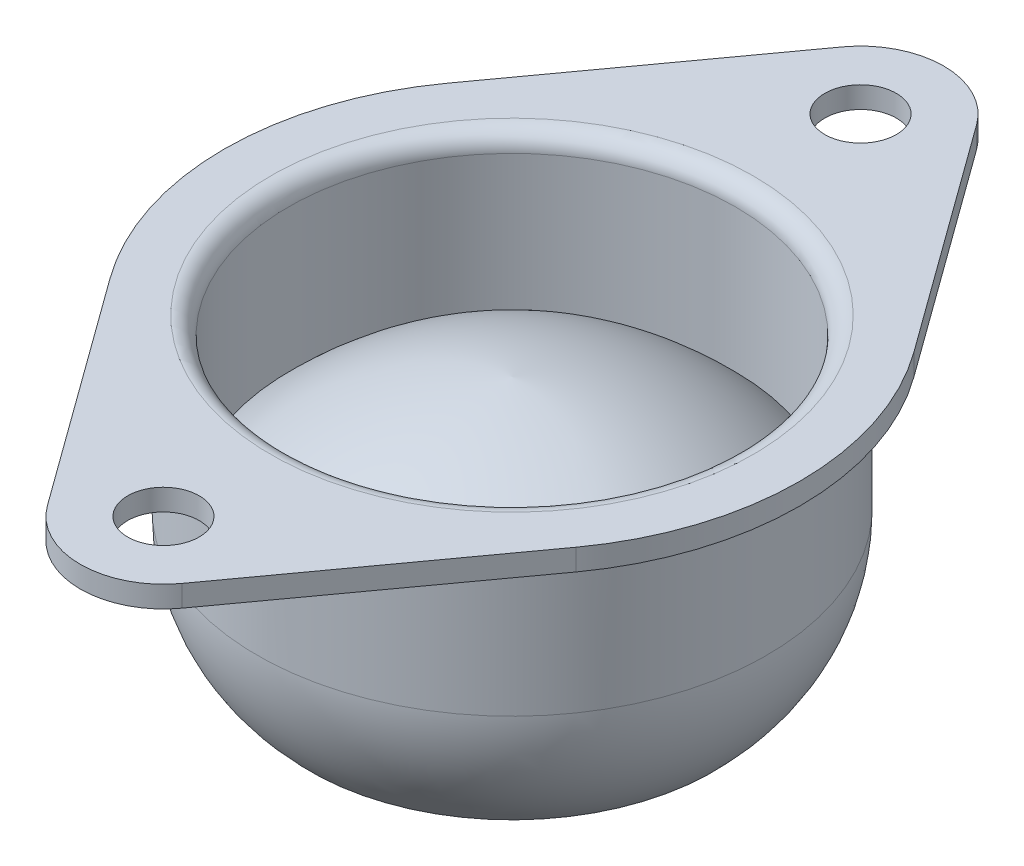
ISO-10303-21;
HEADER;
FILE_DESCRIPTION(('STEP AP214'),'2;1');
FILE_NAME('part.step','',(''),(''),'','','');
FILE_SCHEMA(('AUTOMOTIVE_DESIGN { 1 0 10303 214 1 1 1 1 }'));
ENDSEC;
DATA;
#1=APPLICATION_CONTEXT('core data for automotive mechanical design processes');
#2=APPLICATION_PROTOCOL_DEFINITION('international standard','automotive_design',2000,#1);
#3=PRODUCT_CONTEXT('',#1,'mechanical');
#4=PRODUCT('Part','Part','',(#3));
#5=PRODUCT_RELATED_PRODUCT_CATEGORY('part','',(#4));
#6=PRODUCT_DEFINITION_FORMATION('','',#4);
#7=PRODUCT_DEFINITION_CONTEXT('part definition',#1,'design');
#8=PRODUCT_DEFINITION('design','',#6,#7);
#9=PRODUCT_DEFINITION_SHAPE('','',#8);
#10=(LENGTH_UNIT() NAMED_UNIT(*) SI_UNIT(.MILLI.,.METRE.));
#11=(NAMED_UNIT(*) PLANE_ANGLE_UNIT() SI_UNIT($,.RADIAN.));
#12=(NAMED_UNIT(*) SI_UNIT($,.STERADIAN.) SOLID_ANGLE_UNIT());
#13=UNCERTAINTY_MEASURE_WITH_UNIT(LENGTH_MEASURE(1.E-05),#10,'distance_accuracy_value','');
#14=(GEOMETRIC_REPRESENTATION_CONTEXT(3) GLOBAL_UNCERTAINTY_ASSIGNED_CONTEXT((#13)) GLOBAL_UNIT_ASSIGNED_CONTEXT((#10,
#11,#12)) REPRESENTATION_CONTEXT('',''));
#15=CARTESIAN_POINT('',(0.,0.,0.));
#16=DIRECTION('',(0.,0.,1.));
#17=DIRECTION('',(1.,0.,0.));
#18=AXIS2_PLACEMENT_3D('',#15,#16,#17);
#19=CARTESIAN_POINT('',(0.,-4.21271556201627,0.));
#20=DIRECTION('',(0.,-1.,0.));
#21=DIRECTION('',(0.,0.,-1.));
#22=AXIS2_PLACEMENT_3D('',#19,#20,#21);
#23=CYLINDRICAL_SURFACE('',#22,9.2);
#24=CARTESIAN_POINT('',(0.,-4.21271556201627,0.));
#25=DIRECTION('',(0.,-1.,0.));
#26=DIRECTION('',(0.,0.,-1.));
#27=AXIS2_PLACEMENT_3D('',#24,#25,#26);
#28=CIRCLE('',#27,9.2);
#29=CARTESIAN_POINT('',(-7.44700221203728,-4.21271556201627,5.40205128205128));
#30=VERTEX_POINT('',#29);
#31=CARTESIAN_POINT('',(-7.44700221203728,-4.21271556201627,-5.40205128205128));
#32=VERTEX_POINT('',#31);
#33=EDGE_CURVE('E219',#30,#32,#28,.T.);
#34=ORIENTED_EDGE('',*,*,#33,.T.);
#35=DIRECTION('',(0.,1.,0.));
#36=VECTOR('',#35,1.);
#37=CARTESIAN_POINT('',(-7.44700221203728,-38.0695015819993,-5.40205128205128));
#38=LINE('',#37,#36);
#39=CARTESIAN_POINT('',(-7.44700221203728,-4.89842984773056,-5.40205128205128));
#40=VERTEX_POINT('',#39);
#41=EDGE_CURVE('E191',#40,#32,#38,.T.);
#42=ORIENTED_EDGE('',*,*,#41,.F.);
#43=CARTESIAN_POINT('',(0.,-4.89842984773056,0.));
#44=DIRECTION('',(0.,-1.,0.));
#45=DIRECTION('',(0.,0.,-1.));
#46=AXIS2_PLACEMENT_3D('',#43,#44,#45);
#47=CIRCLE('',#46,9.2);
#48=CARTESIAN_POINT('',(-7.44700221203727,-4.89842984773056,5.40205128205128));
#49=VERTEX_POINT('',#48);
#50=EDGE_CURVE('E214',#49,#40,#47,.T.);
#51=ORIENTED_EDGE('',*,*,#50,.F.);
#52=DIRECTION('',(0.,1.,0.));
#53=VECTOR('',#52,1.);
#54=CARTESIAN_POINT('',(-7.44700221203728,-38.0695015819993,5.40205128205128));
#55=LINE('',#54,#53);
#56=EDGE_CURVE('E58',#49,#30,#55,.T.);
#57=ORIENTED_EDGE('',*,*,#56,.T.);
#58=EDGE_LOOP('',(#34,#42,#51,#57));
#59=FACE_BOUND('',#58,.T.);
#60=ADVANCED_FACE('F42',(#59),#23,.T.);
#61=CARTESIAN_POINT('',(0.,-4.21271556201627,0.));
#62=DIRECTION('',(0.,-1.,0.));
#63=DIRECTION('',(0.,0.,-1.));
#64=AXIS2_PLACEMENT_3D('',#61,#62,#63);
#65=PLANE('',#64);
#66=CARTESIAN_POINT('',(0.,-4.21271556201627,0.));
#67=DIRECTION('',(0.,-1.,0.));
#68=DIRECTION('',(0.,0.,-1.));
#69=AXIS2_PLACEMENT_3D('',#66,#67,#68);
#70=CIRCLE('',#69,7.71428571428572);
#71=CARTESIAN_POINT('',(0.,-4.21271556201627,-7.71428571428572));
#72=VERTEX_POINT('',#71);
#73=EDGE_CURVE('E228',#72,#72,#70,.T.);
#74=ORIENTED_EDGE('',*,*,#73,.T.);
#75=EDGE_LOOP('',(#74));
#76=FACE_BOUND('',#75,.T.);
#77=CARTESIAN_POINT('',(7.44700221203728,-4.21271556201627,-5.40205128205128));
#78=VERTEX_POINT('',#77);
#79=CARTESIAN_POINT('',(7.44700221203728,-4.21271556201627,5.40205128205128));
#80=VERTEX_POINT('',#79);
#81=EDGE_CURVE('E220',#78,#80,#28,.T.);
#82=ORIENTED_EDGE('',*,*,#81,.F.);
#83=DIRECTION('',(0.587179487179487,0.,0.809456762177965));
#84=VECTOR('',#83,1.);
#85=CARTESIAN_POINT('',(7.44700221203727,-4.21271556201627,-5.40205128205128));
#86=LINE('',#85,#84);
#87=CARTESIAN_POINT('',(2.15084225378716,-4.21271556201627,-12.7030769230769));
#88=VERTEX_POINT('',#87);
#89=EDGE_CURVE('E126',#88,#78,#86,.T.);
#90=ORIENTED_EDGE('',*,*,#89,.F.);
#91=CARTESIAN_POINT('',(0.,-4.21271556201627,-11.1428571428571));
#92=DIRECTION('',(0.,1.,0.));
#93=DIRECTION('',(0.,0.,1.));
#94=AXIS2_PLACEMENT_3D('',#91,#92,#93);
#95=CIRCLE('',#94,2.65714285714286);
#96=CARTESIAN_POINT('',(-2.15084225378716,-4.21271556201627,-12.7030769230769));
#97=VERTEX_POINT('',#96);
#98=EDGE_CURVE('E154',#88,#97,#95,.T.);
#99=ORIENTED_EDGE('',*,*,#98,.T.);
#100=DIRECTION('',(-0.587179487179487,0.,0.809456762177965));
#101=VECTOR('',#100,1.);
#102=CARTESIAN_POINT('',(-7.44700221203728,-4.21271556201627,-5.40205128205128));
#103=LINE('',#102,#101);
#104=EDGE_CURVE('E158',#97,#32,#103,.T.);
#105=ORIENTED_EDGE('',*,*,#104,.T.);
#106=ORIENTED_EDGE('',*,*,#33,.F.);
#107=DIRECTION('',(-0.587179487179487,0.,-0.809456762177965));
#108=VECTOR('',#107,1.);
#109=CARTESIAN_POINT('',(-7.44700221203728,-4.21271556201627,5.40205128205128));
#110=LINE('',#109,#108);
#111=CARTESIAN_POINT('',(-2.15084225378716,-4.21271556201627,12.7030769230769));
#112=VERTEX_POINT('',#111);
#113=EDGE_CURVE('E162',#112,#30,#110,.T.);
#114=ORIENTED_EDGE('',*,*,#113,.F.);
#115=CARTESIAN_POINT('',(0.,-4.21271556201627,11.1428571428571));
#116=DIRECTION('',(0.,1.,0.));
#117=DIRECTION('',(0.,0.,1.));
#118=AXIS2_PLACEMENT_3D('',#115,#116,#117);
#119=CIRCLE('',#118,2.65714285714286);
#120=CARTESIAN_POINT('',(2.15084225378716,-4.21271556201627,12.7030769230769));
#121=VERTEX_POINT('',#120);
#122=EDGE_CURVE('E165',#112,#121,#119,.T.);
#123=ORIENTED_EDGE('',*,*,#122,.T.);
#124=DIRECTION('',(0.587179487179487,0.,-0.809456762177965));
#125=VECTOR('',#124,1.);
#126=CARTESIAN_POINT('',(7.44700221203727,-4.21271556201627,5.40205128205128));
#127=LINE('',#126,#125);
#128=EDGE_CURVE('E169',#121,#80,#127,.T.);
#129=ORIENTED_EDGE('',*,*,#128,.T.);
#130=EDGE_LOOP('',(#82,#90,#99,#105,#106,#114,#123,#129));
#131=FACE_BOUND('',#130,.T.);
#132=CARTESIAN_POINT('',(0.,-4.21271556201627,11.1428571428571));
#133=DIRECTION('',(0.,1.,0.));
#134=DIRECTION('',(0.,0.,1.));
#135=AXIS2_PLACEMENT_3D('',#132,#133,#134);
#136=CIRCLE('',#135,1.14285714285714);
#137=CARTESIAN_POINT('',(0.,-4.21271556201627,12.2857142857143));
#138=VERTEX_POINT('',#137);
#139=EDGE_CURVE('E173',#138,#138,#136,.T.);
#140=ORIENTED_EDGE('',*,*,#139,.F.);
#141=EDGE_LOOP('',(#140));
#142=FACE_BOUND('',#141,.T.);
#143=CARTESIAN_POINT('',(0.,-4.21271556201627,-11.1428571428571));
#144=DIRECTION('',(0.,1.,0.));
#145=DIRECTION('',(0.,0.,1.));
#146=AXIS2_PLACEMENT_3D('',#143,#144,#145);
#147=CIRCLE('',#146,1.14285714285714);
#148=CARTESIAN_POINT('',(0.,-4.21271556201627,-10.));
#149=VERTEX_POINT('',#148);
#150=EDGE_CURVE('E122',#149,#149,#147,.T.);
#151=ORIENTED_EDGE('',*,*,#150,.F.);
#152=EDGE_LOOP('',(#151));
#153=FACE_BOUND('',#152,.T.);
#154=ADVANCED_FACE('F247',(#76,#131,#142,#153),#65,.F.);
#155=ORIENTED_EDGE('',*,*,#81,.T.);
#156=DIRECTION('',(0.,1.,0.));
#157=VECTOR('',#156,1.);
#158=CARTESIAN_POINT('',(7.44700221203728,-38.0695015819993,5.40205128205128));
#159=LINE('',#158,#157);
#160=CARTESIAN_POINT('',(7.44700221203727,-4.89842984773056,5.40205128205128));
#161=VERTEX_POINT('',#160);
#162=EDGE_CURVE('E180',#161,#80,#159,.T.);
#163=ORIENTED_EDGE('',*,*,#162,.F.);
#164=CARTESIAN_POINT('',(7.44700221203727,-4.89842984773056,-5.40205128205128));
#165=VERTEX_POINT('',#164);
#166=EDGE_CURVE('E215',#165,#161,#47,.T.);
#167=ORIENTED_EDGE('',*,*,#166,.F.);
#168=DIRECTION('',(0.,1.,0.));
#169=VECTOR('',#168,1.);
#170=CARTESIAN_POINT('',(7.44700221203728,-38.0695015819993,-5.40205128205128));
#171=LINE('',#170,#169);
#172=EDGE_CURVE('E66',#165,#78,#171,.T.);
#173=ORIENTED_EDGE('',*,*,#172,.T.);
#174=EDGE_LOOP('',(#155,#163,#167,#173));
#175=FACE_BOUND('',#174,.T.);
#176=ADVANCED_FACE('F250',(#175),#23,.T.);
#177=CARTESIAN_POINT('',(-9.2,-4.89842984773056,0.));
#178=DIRECTION('',(0.,1.,0.));
#179=DIRECTION('',(0.,0.,1.));
#180=AXIS2_PLACEMENT_3D('',#177,#178,#179);
#181=PLANE('',#180);
#182=CARTESIAN_POINT('',(0.,-4.89842984773056,0.));
#183=DIRECTION('',(0.,1.,0.));
#184=DIRECTION('',(0.,0.,1.));
#185=AXIS2_PLACEMENT_3D('',#182,#183,#184);
#186=CIRCLE('',#185,8.71428571428571);
#187=CARTESIAN_POINT('',(0.,-4.89842984773056,8.71428571428571));
#188=VERTEX_POINT('',#187);
#189=EDGE_CURVE('E11',#188,#188,#186,.T.);
#190=ORIENTED_EDGE('',*,*,#189,.T.);
#191=EDGE_LOOP('',(#190));
#192=FACE_BOUND('',#191,.T.);
#193=ORIENTED_EDGE('',*,*,#166,.T.);
#194=DIRECTION('',(-0.587179487179487,0.,0.809456762177965));
#195=VECTOR('',#194,1.);
#196=CARTESIAN_POINT('',(7.44700221203727,-4.89842984773056,5.40205128205128));
#197=LINE('',#196,#195);
#198=CARTESIAN_POINT('',(2.15084225378716,-4.89842984773056,12.7030769230769));
#199=VERTEX_POINT('',#198);
#200=EDGE_CURVE('E147',#161,#199,#197,.T.);
#201=ORIENTED_EDGE('',*,*,#200,.T.);
#202=CARTESIAN_POINT('',(0.,-4.89842984773056,11.1428571428571));
#203=DIRECTION('',(0.,1.,0.));
#204=DIRECTION('',(0.,0.,1.));
#205=AXIS2_PLACEMENT_3D('',#202,#203,#204);
#206=CIRCLE('',#205,2.65714285714286);
#207=CARTESIAN_POINT('',(-2.15084225378716,-4.89842984773056,12.7030769230769));
#208=VERTEX_POINT('',#207);
#209=EDGE_CURVE('E144',#199,#208,#206,.F.);
#210=ORIENTED_EDGE('',*,*,#209,.T.);
#211=DIRECTION('',(0.587179487179487,0.,0.809456762177965));
#212=VECTOR('',#211,1.);
#213=CARTESIAN_POINT('',(-7.44700221203728,-4.89842984773056,5.40205128205128));
#214=LINE('',#213,#212);
#215=EDGE_CURVE('E141',#49,#208,#214,.T.);
#216=ORIENTED_EDGE('',*,*,#215,.F.);
#217=ORIENTED_EDGE('',*,*,#50,.T.);
#218=DIRECTION('',(0.587179487179487,0.,-0.809456762177965));
#219=VECTOR('',#218,1.);
#220=CARTESIAN_POINT('',(-7.44700221203728,-4.89842984773056,-5.40205128205128));
#221=LINE('',#220,#219);
#222=CARTESIAN_POINT('',(-2.15084225378716,-4.89842984773056,-12.7030769230769));
#223=VERTEX_POINT('',#222);
#224=EDGE_CURVE('E138',#40,#223,#221,.T.);
#225=ORIENTED_EDGE('',*,*,#224,.T.);
#226=CARTESIAN_POINT('',(0.,-4.89842984773056,-11.1428571428571));
#227=DIRECTION('',(0.,1.,0.));
#228=DIRECTION('',(0.,0.,1.));
#229=AXIS2_PLACEMENT_3D('',#226,#227,#228);
#230=CIRCLE('',#229,2.65714285714286);
#231=CARTESIAN_POINT('',(2.15084225378716,-4.89842984773056,-12.7030769230769));
#232=VERTEX_POINT('',#231);
#233=EDGE_CURVE('E134',#223,#232,#230,.F.);
#234=ORIENTED_EDGE('',*,*,#233,.T.);
#235=DIRECTION('',(-0.587179487179487,0.,-0.809456762177965));
#236=VECTOR('',#235,1.);
#237=CARTESIAN_POINT('',(7.44700221203727,-4.89842984773056,-5.40205128205128));
#238=LINE('',#237,#236);
#239=EDGE_CURVE('E137',#165,#232,#238,.T.);
#240=ORIENTED_EDGE('',*,*,#239,.F.);
#241=EDGE_LOOP('',(#193,#201,#210,#216,#217,#225,#234,#240));
#242=FACE_BOUND('',#241,.T.);
#243=CARTESIAN_POINT('',(0.,-4.89842984773056,11.1428571428571));
#244=DIRECTION('',(0.,1.,0.));
#245=DIRECTION('',(0.,0.,1.));
#246=AXIS2_PLACEMENT_3D('',#243,#244,#245);
#247=CIRCLE('',#246,1.14285714285714);
#248=CARTESIAN_POINT('',(0.,-4.89842984773056,12.2857142857143));
#249=VERTEX_POINT('',#248);
#250=EDGE_CURVE('E133',#249,#249,#247,.F.);
#251=ORIENTED_EDGE('',*,*,#250,.F.);
#252=EDGE_LOOP('',(#251));
#253=FACE_BOUND('',#252,.T.);
#254=CARTESIAN_POINT('',(0.,-4.89842984773056,-11.1428571428571));
#255=DIRECTION('',(0.,1.,0.));
#256=DIRECTION('',(0.,0.,1.));
#257=AXIS2_PLACEMENT_3D('',#254,#255,#256);
#258=CIRCLE('',#257,1.14285714285714);
#259=CARTESIAN_POINT('',(0.,-4.89842984773056,-10.));
#260=VERTEX_POINT('',#259);
#261=EDGE_CURVE('E129',#260,#260,#258,.F.);
#262=ORIENTED_EDGE('',*,*,#261,.F.);
#263=EDGE_LOOP('',(#262));
#264=FACE_BOUND('',#263,.T.);
#265=ADVANCED_FACE('F259',(#192,#242,#253,#264),#181,.F.);
#266=CARTESIAN_POINT('',(0.,-4.21271556201627,0.));
#267=DIRECTION('',(0.,-1.,0.));
#268=DIRECTION('',(0.,0.,-1.));
#269=AXIS2_PLACEMENT_3D('',#266,#267,#268);
#270=CYLINDRICAL_SURFACE('',#269,8.14285714285714);
#271=CARTESIAN_POINT('',(0.,-5.46985841915913,0.));
#272=DIRECTION('',(0.,1.,0.));
#273=DIRECTION('',(0.,0.,1.));
#274=AXIS2_PLACEMENT_3D('',#271,#272,#273);
#275=CIRCLE('',#274,8.14285714285714);
#276=CARTESIAN_POINT('',(0.,-5.46985841915913,8.14285714285714));
#277=VERTEX_POINT('',#276);
#278=EDGE_CURVE('E51',#277,#277,#275,.F.);
#279=ORIENTED_EDGE('',*,*,#278,.T.);
#280=EDGE_LOOP('',(#279));
#281=FACE_BOUND('',#280,.T.);
#282=CARTESIAN_POINT('',(0.,-9.56047074570608,0.));
#283=DIRECTION('',(0.,-1.,0.));
#284=DIRECTION('',(0.,0.,-1.));
#285=AXIS2_PLACEMENT_3D('',#282,#283,#284);
#286=CIRCLE('',#285,8.14285714285714);
#287=CARTESIAN_POINT('',(0.,-9.56047074570608,-8.14285714285714));
#288=VERTEX_POINT('',#287);
#289=EDGE_CURVE('E210',#288,#288,#286,.T.);
#290=ORIENTED_EDGE('',*,*,#289,.F.);
#291=EDGE_LOOP('',(#290));
#292=FACE_BOUND('',#291,.T.);
#293=ADVANCED_FACE('F235',(#281,#292),#270,.T.);
#294=CARTESIAN_POINT('',(0.,-9.56047074570608,0.));
#295=DIRECTION('',(0.,-1.,0.));
#296=DIRECTION('',(0.,0.,-1.));
#297=AXIS2_PLACEMENT_3D('',#294,#295,#296);
#298=DEGENERATE_TOROIDAL_SURFACE('',#297,2.42857142857143,5.71428571428571,.T.);
#299=CARTESIAN_POINT('',(0.,-13.6412869905877,0.));
#300=DIRECTION('',(0.,-1.,0.));
#301=DIRECTION('',(0.,0.,-1.));
#302=AXIS2_PLACEMENT_3D('',#299,#300,#301);
#303=CIRCLE('',#302,6.42857142857143);
#304=CARTESIAN_POINT('',(0.,-13.6412869905877,-6.42857142857143));
#305=VERTEX_POINT('',#304);
#306=EDGE_CURVE('E206',#305,#305,#303,.T.);
#307=ORIENTED_EDGE('',*,*,#306,.F.);
#308=EDGE_LOOP('',(#307));
#309=FACE_BOUND('',#308,.T.);
#310=ORIENTED_EDGE('',*,*,#289,.T.);
#311=EDGE_LOOP('',(#310));
#312=FACE_BOUND('',#311,.T.);
#313=ADVANCED_FACE('F318',(#309,#312),#298,.T.);
#314=CARTESIAN_POINT('',(0.,-12.179534854485,0.));
#315=DIRECTION('',(0.,-1.,0.));
#316=DIRECTION('',(0.,0.,-1.));
#317=AXIS2_PLACEMENT_3D('',#314,#315,#316);
#318=TOROIDAL_SURFACE('',#317,5.53299552290893,1.71428571428571);
#319=CARTESIAN_POINT('',(0.,-13.3555727048734,0.));
#320=DIRECTION('',(0.,-1.,0.));
#321=DIRECTION('',(0.,0.,-1.));
#322=AXIS2_PLACEMENT_3D('',#319,#320,#321);
#323=CIRCLE('',#322,4.28571428571429);
#324=CARTESIAN_POINT('',(0.,-13.3555727048734,-4.28571428571429));
#325=VERTEX_POINT('',#324);
#326=EDGE_CURVE('E202',#325,#325,#323,.T.);
#327=ORIENTED_EDGE('',*,*,#326,.F.);
#328=EDGE_LOOP('',(#327));
#329=FACE_BOUND('',#328,.T.);
#330=ORIENTED_EDGE('',*,*,#306,.T.);
#331=EDGE_LOOP('',(#330));
#332=FACE_BOUND('',#331,.T.);
#333=ADVANCED_FACE('F314',(#329,#332),#318,.T.);
#334=CARTESIAN_POINT('',(0.,-11.5698584191591,0.));
#335=DIRECTION('',(0.,-1.,0.));
#336=DIRECTION('',(-1.,0.,0.));
#337=AXIS2_PLACEMENT_3D('',#334,#335,#336);
#338=SPHERICAL_SURFACE('',#337,4.64285714285714);
#339=ORIENTED_EDGE('',*,*,#326,.T.);
#340=EDGE_LOOP('',(#339));
#341=FACE_BOUND('',#340,.T.);
#342=ADVANCED_FACE('F311',(#341),#338,.T.);
#343=CARTESIAN_POINT('',(0.,-38.0695015819993,11.1428571428571));
#344=DIRECTION('',(0.,1.,0.));
#345=DIRECTION('',(0.,0.,1.));
#346=AXIS2_PLACEMENT_3D('',#343,#344,#345);
#347=CYLINDRICAL_SURFACE('',#346,2.65714285714286);
#348=ORIENTED_EDGE('',*,*,#209,.F.);
#349=DIRECTION('',(0.,1.,0.));
#350=VECTOR('',#349,1.);
#351=CARTESIAN_POINT('',(2.15084225378716,-38.0695015819993,12.7030769230769));
#352=LINE('',#351,#350);
#353=EDGE_CURVE('E183',#199,#121,#352,.T.);
#354=ORIENTED_EDGE('',*,*,#353,.T.);
#355=ORIENTED_EDGE('',*,*,#122,.F.);
#356=DIRECTION('',(0.,1.,0.));
#357=VECTOR('',#356,1.);
#358=CARTESIAN_POINT('',(-2.15084225378716,-38.0695015819993,12.7030769230769));
#359=LINE('',#358,#357);
#360=EDGE_CURVE('E186',#208,#112,#359,.T.);
#361=ORIENTED_EDGE('',*,*,#360,.F.);
#362=EDGE_LOOP('',(#348,#354,#355,#361));
#363=FACE_BOUND('',#362,.T.);
#364=ADVANCED_FACE('F283',(#363),#347,.T.);
#365=CARTESIAN_POINT('',(0.,-38.0695015819993,11.1428571428571));
#366=DIRECTION('',(0.,1.,0.));
#367=DIRECTION('',(0.,0.,1.));
#368=AXIS2_PLACEMENT_3D('',#365,#366,#367);
#369=CYLINDRICAL_SURFACE('',#368,1.14285714285714);
#370=ORIENTED_EDGE('',*,*,#250,.T.);
#371=EDGE_LOOP('',(#370));
#372=FACE_BOUND('',#371,.T.);
#373=ORIENTED_EDGE('',*,*,#139,.T.);
#374=EDGE_LOOP('',(#373));
#375=FACE_BOUND('',#374,.T.);
#376=ADVANCED_FACE('F346',(#372,#375),#369,.F.);
#377=CARTESIAN_POINT('',(7.44700221203727,-38.0695015819993,5.40205128205128));
#378=DIRECTION('',(0.809456762177965,0.,0.587179487179487));
#379=DIRECTION('',(0.587179487179487,0.,-0.809456762177965));
#380=AXIS2_PLACEMENT_3D('',#377,#378,#379);
#381=PLANE('',#380);
#382=ORIENTED_EDGE('',*,*,#200,.F.);
#383=ORIENTED_EDGE('',*,*,#162,.T.);
#384=ORIENTED_EDGE('',*,*,#128,.F.);
#385=ORIENTED_EDGE('',*,*,#353,.F.);
#386=EDGE_LOOP('',(#382,#383,#384,#385));
#387=FACE_BOUND('',#386,.T.);
#388=ADVANCED_FACE('F277',(#387),#381,.T.);
#389=CARTESIAN_POINT('',(-7.44700221203728,-38.0695015819993,5.40205128205128));
#390=DIRECTION('',(0.809456762177965,0.,-0.587179487179487));
#391=DIRECTION('',(-0.587179487179487,0.,-0.809456762177965));
#392=AXIS2_PLACEMENT_3D('',#389,#390,#391);
#393=PLANE('',#392);
#394=ORIENTED_EDGE('',*,*,#56,.F.);
#395=ORIENTED_EDGE('',*,*,#215,.T.);
#396=ORIENTED_EDGE('',*,*,#360,.T.);
#397=ORIENTED_EDGE('',*,*,#113,.T.);
#398=EDGE_LOOP('',(#394,#395,#396,#397));
#399=FACE_BOUND('',#398,.T.);
#400=ADVANCED_FACE('F284',(#399),#393,.F.);
#401=CARTESIAN_POINT('',(0.,-38.0695015819993,-11.1428571428571));
#402=DIRECTION('',(0.,1.,0.));
#403=DIRECTION('',(0.,0.,1.));
#404=AXIS2_PLACEMENT_3D('',#401,#402,#403);
#405=CYLINDRICAL_SURFACE('',#404,2.65714285714286);
#406=ORIENTED_EDGE('',*,*,#233,.F.);
#407=DIRECTION('',(0.,1.,0.));
#408=VECTOR('',#407,1.);
#409=CARTESIAN_POINT('',(-2.15084225378716,-38.0695015819993,-12.7030769230769));
#410=LINE('',#409,#408);
#411=EDGE_CURVE('E194',#223,#97,#410,.T.);
#412=ORIENTED_EDGE('',*,*,#411,.T.);
#413=ORIENTED_EDGE('',*,*,#98,.F.);
#414=DIRECTION('',(0.,1.,0.));
#415=VECTOR('',#414,1.);
#416=CARTESIAN_POINT('',(2.15084225378716,-38.0695015819993,-12.7030769230769));
#417=LINE('',#416,#415);
#418=EDGE_CURVE('E177',#232,#88,#417,.T.);
#419=ORIENTED_EDGE('',*,*,#418,.F.);
#420=EDGE_LOOP('',(#406,#412,#413,#419));
#421=FACE_BOUND('',#420,.T.);
#422=ADVANCED_FACE('F298',(#421),#405,.T.);
#423=CARTESIAN_POINT('',(-7.44700221203728,-38.0695015819993,-5.40205128205128));
#424=DIRECTION('',(-0.809456762177965,0.,-0.587179487179487));
#425=DIRECTION('',(-0.587179487179487,0.,0.809456762177965));
#426=AXIS2_PLACEMENT_3D('',#423,#424,#425);
#427=PLANE('',#426);
#428=ORIENTED_EDGE('',*,*,#224,.F.);
#429=ORIENTED_EDGE('',*,*,#41,.T.);
#430=ORIENTED_EDGE('',*,*,#104,.F.);
#431=ORIENTED_EDGE('',*,*,#411,.F.);
#432=EDGE_LOOP('',(#428,#429,#430,#431));
#433=FACE_BOUND('',#432,.T.);
#434=ADVANCED_FACE('F294',(#433),#427,.T.);
#435=CARTESIAN_POINT('',(7.44700221203727,-38.0695015819993,-5.40205128205128));
#436=DIRECTION('',(-0.809456762177965,0.,0.587179487179487));
#437=DIRECTION('',(0.587179487179487,0.,0.809456762177965));
#438=AXIS2_PLACEMENT_3D('',#435,#436,#437);
#439=PLANE('',#438);
#440=ORIENTED_EDGE('',*,*,#172,.F.);
#441=ORIENTED_EDGE('',*,*,#239,.T.);
#442=ORIENTED_EDGE('',*,*,#418,.T.);
#443=ORIENTED_EDGE('',*,*,#89,.T.);
#444=EDGE_LOOP('',(#440,#441,#442,#443));
#445=FACE_BOUND('',#444,.T.);
#446=ADVANCED_FACE('F299',(#445),#439,.F.);
#447=CARTESIAN_POINT('',(0.,-38.0695015819993,-11.1428571428571));
#448=DIRECTION('',(0.,1.,0.));
#449=DIRECTION('',(0.,0.,1.));
#450=AXIS2_PLACEMENT_3D('',#447,#448,#449);
#451=CYLINDRICAL_SURFACE('',#450,1.14285714285714);
#452=ORIENTED_EDGE('',*,*,#261,.T.);
#453=EDGE_LOOP('',(#452));
#454=FACE_BOUND('',#453,.T.);
#455=ORIENTED_EDGE('',*,*,#150,.T.);
#456=EDGE_LOOP('',(#455));
#457=FACE_BOUND('',#456,.T.);
#458=ADVANCED_FACE('F115',(#454,#457),#451,.F.);
#459=CARTESIAN_POINT('',(0.,-17.3056127936304,-1.0674478140319));
#460=DIRECTION('',(-1.,0.,0.));
#461=DIRECTION('',(0.,0.,1.));
#462=AXIS2_PLACEMENT_3D('',#459,#460,#461);
#463=CIRCLE('',#462,11.4285714285714);
#464=TRIMMED_CURVE('',#463,(PARAMETER_VALUE(-1.47725830305523)),
(PARAMETER_VALUE(1.47725830305523)),.T.,.PARAMETER.);
#465=CARTESIAN_POINT('',(0.,-17.3056127936304,0.));
#466=DIRECTION('',(0.,1.,0.));
#467=AXIS1_PLACEMENT('',#465,#466);
#468=SURFACE_OF_REVOLUTION('',#464,#467);
#469=CARTESIAN_POINT('',(0.,-5.92700127630199,0.));
#470=VERTEX_POINT('',#469);
#471=VERTEX_LOOP('',#470);
#472=FACE_BOUND('',#471,.T.);
#473=CARTESIAN_POINT('',(0.,-9.35557270487342,0.));
#474=DIRECTION('',(0.,1.,0.));
#475=DIRECTION('',(0.,0.,1.));
#476=AXIS2_PLACEMENT_3D('',#473,#474,#475);
#477=CIRCLE('',#476,7.14285714285714);
#478=CARTESIAN_POINT('',(0.,-9.35557270487342,7.14285714285714));
#479=VERTEX_POINT('',#478);
#480=EDGE_CURVE('E119',#479,#479,#477,.T.);
#481=ORIENTED_EDGE('',*,*,#480,.T.);
#482=EDGE_LOOP('',(#481));
#483=FACE_BOUND('',#482,.T.);
#484=ADVANCED_FACE('F111',(#472,#483),#468,.T.);
#485=CARTESIAN_POINT('',(0.,-4.21271556201627,0.));
#486=DIRECTION('',(0.,1.,0.));
#487=DIRECTION('',(0.,0.,1.));
#488=AXIS2_PLACEMENT_3D('',#485,#486,#487);
#489=CYLINDRICAL_SURFACE('',#488,7.14285714285714);
#490=CARTESIAN_POINT('',(0.,-4.78414413344484,0.));
#491=DIRECTION('',(0.,-1.,0.));
#492=DIRECTION('',(0.,0.,-1.));
#493=AXIS2_PLACEMENT_3D('',#490,#491,#492);
#494=CIRCLE('',#493,7.14285714285714);
#495=CARTESIAN_POINT('',(0.,-4.78414413344484,-7.14285714285714));
#496=VERTEX_POINT('',#495);
#497=EDGE_CURVE('E224',#496,#496,#494,.F.);
#498=ORIENTED_EDGE('',*,*,#497,.T.);
#499=EDGE_LOOP('',(#498));
#500=FACE_BOUND('',#499,.T.);
#501=ORIENTED_EDGE('',*,*,#480,.F.);
#502=EDGE_LOOP('',(#501));
#503=FACE_BOUND('',#502,.T.);
#504=ADVANCED_FACE('F114',(#500,#503),#489,.F.);
#505=CARTESIAN_POINT('',(0.,-4.78414413344484,0.));
#506=DIRECTION('',(0.,-1.,0.));
#507=DIRECTION('',(0.,0.,-1.));
#508=AXIS2_PLACEMENT_3D('',#505,#506,#507);
#509=TOROIDAL_SURFACE('',#508,7.71428571428572,0.571428571428571);
#510=ORIENTED_EDGE('',*,*,#73,.F.);
#511=EDGE_LOOP('',(#510));
#512=FACE_BOUND('',#511,.T.);
#513=ORIENTED_EDGE('',*,*,#497,.F.);
#514=EDGE_LOOP('',(#513));
#515=FACE_BOUND('',#514,.T.);
#516=ADVANCED_FACE('F239',(#512,#515),#509,.T.);
#517=CARTESIAN_POINT('',(0.,-5.46985841915913,0.));
#518=DIRECTION('',(0.,1.,0.));
#519=DIRECTION('',(0.,0.,1.));
#520=AXIS2_PLACEMENT_3D('',#517,#518,#519);
#521=TOROIDAL_SURFACE('',#520,8.71428571428571,0.571428571428571);
#522=ORIENTED_EDGE('',*,*,#189,.F.);
#523=EDGE_LOOP('',(#522));
#524=FACE_BOUND('',#523,.T.);
#525=ORIENTED_EDGE('',*,*,#278,.F.);
#526=EDGE_LOOP('',(#525));
#527=FACE_BOUND('',#526,.T.);
#528=ADVANCED_FACE('F44',(#524,#527),#521,.F.);
#529=CLOSED_SHELL('',(#60,#154,#176,#265,#293,#313,#333,#342,#364,#376,#388,#400,#422,#434,#446,
#458,#484,#504,#516,#528));
#530=MANIFOLD_SOLID_BREP('B2',#529);
#531=ADVANCED_BREP_SHAPE_REPRESENTATION('',(#18,#530),#14);
#532=SHAPE_DEFINITION_REPRESENTATION(#9,#531);
ENDSEC;
END-ISO-10303-21;
